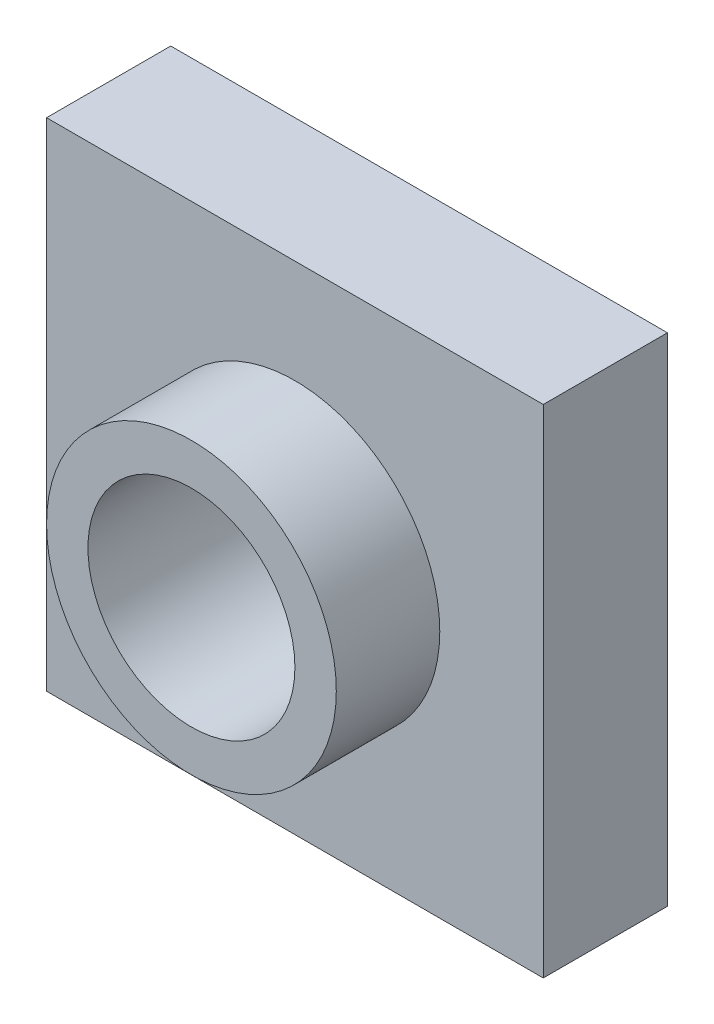
ISO-10303-21;
HEADER;
FILE_DESCRIPTION(('STEP AP214'),'2;1');
FILE_NAME('part.step','',(''),(''),'','','');
FILE_SCHEMA(('AUTOMOTIVE_DESIGN { 1 0 10303 214 1 1 1 1 }'));
ENDSEC;
DATA;
#1=APPLICATION_CONTEXT('core data for automotive mechanical design processes');
#2=APPLICATION_PROTOCOL_DEFINITION('international standard','automotive_design',2000,#1);
#3=PRODUCT_CONTEXT('',#1,'mechanical');
#4=PRODUCT('Part','Part','',(#3));
#5=PRODUCT_RELATED_PRODUCT_CATEGORY('part','',(#4));
#6=PRODUCT_DEFINITION_FORMATION('','',#4);
#7=PRODUCT_DEFINITION_CONTEXT('part definition',#1,'design');
#8=PRODUCT_DEFINITION('design','',#6,#7);
#9=PRODUCT_DEFINITION_SHAPE('','',#8);
#10=(LENGTH_UNIT() NAMED_UNIT(*) SI_UNIT(.MILLI.,.METRE.));
#11=(NAMED_UNIT(*) PLANE_ANGLE_UNIT() SI_UNIT($,.RADIAN.));
#12=(NAMED_UNIT(*) SI_UNIT($,.STERADIAN.) SOLID_ANGLE_UNIT());
#13=UNCERTAINTY_MEASURE_WITH_UNIT(LENGTH_MEASURE(1.E-05),#10,'distance_accuracy_value','');
#14=(GEOMETRIC_REPRESENTATION_CONTEXT(3) GLOBAL_UNCERTAINTY_ASSIGNED_CONTEXT((#13)) GLOBAL_UNIT_ASSIGNED_CONTEXT((#10,
#11,#12)) REPRESENTATION_CONTEXT('',''));
#15=CARTESIAN_POINT('',(0.,0.,0.));
#16=DIRECTION('',(0.,0.,1.));
#17=DIRECTION('',(1.,0.,0.));
#18=AXIS2_PLACEMENT_3D('',#15,#16,#17);
#19=CARTESIAN_POINT('',(0.,120.,30.));
#20=DIRECTION('',(0.,0.,-1.));
#21=DIRECTION('',(-1.,0.,0.));
#22=AXIS2_PLACEMENT_3D('',#19,#20,#21);
#23=PLANE('',#22);
#24=DIRECTION('',(0.,-1.,0.));
#25=VECTOR('',#24,1.);
#26=CARTESIAN_POINT('',(0.,0.,30.));
#27=LINE('',#26,#25);
#28=CARTESIAN_POINT('',(0.,120.,30.));
#29=VERTEX_POINT('',#28);
#30=CARTESIAN_POINT('',(0.,0.,30.));
#31=VERTEX_POINT('',#30);
#32=EDGE_CURVE('E95',#29,#31,#27,.T.);
#33=ORIENTED_EDGE('',*,*,#32,.T.);
#34=DIRECTION('',(1.,0.,0.));
#35=VECTOR('',#34,1.);
#36=CARTESIAN_POINT('',(0.,0.,30.));
#37=LINE('',#36,#35);
#38=CARTESIAN_POINT('',(120.,0.,30.));
#39=VERTEX_POINT('',#38);
#40=EDGE_CURVE('E90',#31,#39,#37,.T.);
#41=ORIENTED_EDGE('',*,*,#40,.T.);
#42=DIRECTION('',(0.,1.,0.));
#43=VECTOR('',#42,1.);
#44=CARTESIAN_POINT('',(120.,0.,30.));
#45=LINE('',#44,#43);
#46=CARTESIAN_POINT('',(120.,120.,30.));
#47=VERTEX_POINT('',#46);
#48=EDGE_CURVE('E93',#39,#47,#45,.T.);
#49=ORIENTED_EDGE('',*,*,#48,.T.);
#50=DIRECTION('',(-1.,0.,0.));
#51=VECTOR('',#50,1.);
#52=CARTESIAN_POINT('',(0.,120.,30.));
#53=LINE('',#52,#51);
#54=EDGE_CURVE('E59',#47,#29,#53,.T.);
#55=ORIENTED_EDGE('',*,*,#54,.T.);
#56=EDGE_LOOP('',(#33,#41,#49,#55));
#57=FACE_BOUND('',#56,.T.);
#58=CARTESIAN_POINT('',(60.,60.,30.));
#59=DIRECTION('',(0.,0.,-1.));
#60=DIRECTION('',(-1.,0.,0.));
#61=AXIS2_PLACEMENT_3D('',#58,#59,#60);
#62=CIRCLE('',#61,35.);
#63=CARTESIAN_POINT('',(25.,60.,30.));
#64=VERTEX_POINT('',#63);
#65=EDGE_CURVE('E11',#64,#64,#62,.F.);
#66=ORIENTED_EDGE('',*,*,#65,.F.);
#67=EDGE_LOOP('',(#66));
#68=FACE_BOUND('',#67,.T.);
#69=ADVANCED_FACE('F42',(#57,#68),#23,.F.);
#70=CARTESIAN_POINT('',(0.,0.,30.));
#71=DIRECTION('',(1.,0.,0.));
#72=DIRECTION('',(0.,0.,-1.));
#73=AXIS2_PLACEMENT_3D('',#70,#71,#72);
#74=PLANE('',#73);
#75=DIRECTION('',(0.,-1.,0.));
#76=VECTOR('',#75,1.);
#77=CARTESIAN_POINT('',(0.,0.,0.));
#78=LINE('',#77,#76);
#79=CARTESIAN_POINT('',(0.,120.,0.));
#80=VERTEX_POINT('',#79);
#81=CARTESIAN_POINT('',(0.,0.,0.));
#82=VERTEX_POINT('',#81);
#83=EDGE_CURVE('E109',#80,#82,#78,.T.);
#84=ORIENTED_EDGE('',*,*,#83,.T.);
#85=DIRECTION('',(0.,0.,-1.));
#86=VECTOR('',#85,1.);
#87=CARTESIAN_POINT('',(0.,0.,30.));
#88=LINE('',#87,#86);
#89=EDGE_CURVE('E51',#31,#82,#88,.T.);
#90=ORIENTED_EDGE('',*,*,#89,.F.);
#91=ORIENTED_EDGE('',*,*,#32,.F.);
#92=DIRECTION('',(0.,0.,-1.));
#93=VECTOR('',#92,1.);
#94=CARTESIAN_POINT('',(0.,120.,30.));
#95=LINE('',#94,#93);
#96=EDGE_CURVE('E105',#29,#80,#95,.T.);
#97=ORIENTED_EDGE('',*,*,#96,.T.);
#98=EDGE_LOOP('',(#84,#90,#91,#97));
#99=FACE_BOUND('',#98,.T.);
#100=ADVANCED_FACE('F44',(#99),#74,.F.);
#101=CARTESIAN_POINT('',(0.,0.,30.));
#102=DIRECTION('',(0.,1.,0.));
#103=DIRECTION('',(0.,0.,1.));
#104=AXIS2_PLACEMENT_3D('',#101,#102,#103);
#105=PLANE('',#104);
#106=DIRECTION('',(1.,0.,0.));
#107=VECTOR('',#106,1.);
#108=CARTESIAN_POINT('',(0.,0.,0.));
#109=LINE('',#108,#107);
#110=CARTESIAN_POINT('',(120.,0.,0.));
#111=VERTEX_POINT('',#110);
#112=EDGE_CURVE('E100',#82,#111,#109,.T.);
#113=ORIENTED_EDGE('',*,*,#112,.T.);
#114=DIRECTION('',(0.,0.,-1.));
#115=VECTOR('',#114,1.);
#116=CARTESIAN_POINT('',(120.,0.,30.));
#117=LINE('',#116,#115);
#118=EDGE_CURVE('E98',#39,#111,#117,.T.);
#119=ORIENTED_EDGE('',*,*,#118,.F.);
#120=ORIENTED_EDGE('',*,*,#40,.F.);
#121=ORIENTED_EDGE('',*,*,#89,.T.);
#122=EDGE_LOOP('',(#113,#119,#120,#121));
#123=FACE_BOUND('',#122,.T.);
#124=ADVANCED_FACE('F99',(#123),#105,.F.);
#125=CARTESIAN_POINT('',(120.,0.,30.));
#126=DIRECTION('',(-1.,0.,0.));
#127=DIRECTION('',(0.,0.,1.));
#128=AXIS2_PLACEMENT_3D('',#125,#126,#127);
#129=PLANE('',#128);
#130=DIRECTION('',(0.,1.,0.));
#131=VECTOR('',#130,1.);
#132=CARTESIAN_POINT('',(120.,0.,0.));
#133=LINE('',#132,#131);
#134=CARTESIAN_POINT('',(120.,120.,0.));
#135=VERTEX_POINT('',#134);
#136=EDGE_CURVE('E76',#111,#135,#133,.T.);
#137=ORIENTED_EDGE('',*,*,#136,.T.);
#138=DIRECTION('',(0.,0.,-1.));
#139=VECTOR('',#138,1.);
#140=CARTESIAN_POINT('',(120.,120.,30.));
#141=LINE('',#140,#139);
#142=EDGE_CURVE('E101',#47,#135,#141,.T.);
#143=ORIENTED_EDGE('',*,*,#142,.F.);
#144=ORIENTED_EDGE('',*,*,#48,.F.);
#145=ORIENTED_EDGE('',*,*,#118,.T.);
#146=EDGE_LOOP('',(#137,#143,#144,#145));
#147=FACE_BOUND('',#146,.T.);
#148=ADVANCED_FACE('F103',(#147),#129,.F.);
#149=CARTESIAN_POINT('',(0.,120.,30.));
#150=DIRECTION('',(0.,-1.,0.));
#151=DIRECTION('',(0.,0.,-1.));
#152=AXIS2_PLACEMENT_3D('',#149,#150,#151);
#153=PLANE('',#152);
#154=DIRECTION('',(-1.,0.,0.));
#155=VECTOR('',#154,1.);
#156=CARTESIAN_POINT('',(0.,120.,0.));
#157=LINE('',#156,#155);
#158=EDGE_CURVE('E82',#135,#80,#157,.T.);
#159=ORIENTED_EDGE('',*,*,#158,.T.);
#160=ORIENTED_EDGE('',*,*,#96,.F.);
#161=ORIENTED_EDGE('',*,*,#54,.F.);
#162=ORIENTED_EDGE('',*,*,#142,.T.);
#163=EDGE_LOOP('',(#159,#160,#161,#162));
#164=FACE_BOUND('',#163,.T.);
#165=ADVANCED_FACE('F123',(#164),#153,.F.);
#166=CARTESIAN_POINT('',(0.,120.,0.));
#167=DIRECTION('',(0.,0.,-1.));
#168=DIRECTION('',(-1.,0.,0.));
#169=AXIS2_PLACEMENT_3D('',#166,#167,#168);
#170=PLANE('',#169);
#171=CARTESIAN_POINT('',(60.,60.,0.));
#172=DIRECTION('',(0.,0.,1.));
#173=DIRECTION('',(1.,0.,0.));
#174=AXIS2_PLACEMENT_3D('',#171,#172,#173);
#175=CIRCLE('',#174,25.);
#176=CARTESIAN_POINT('',(85.,60.,0.));
#177=VERTEX_POINT('',#176);
#178=EDGE_CURVE('E151',#177,#177,#175,.T.);
#179=ORIENTED_EDGE('',*,*,#178,.T.);
#180=EDGE_LOOP('',(#179));
#181=FACE_BOUND('',#180,.T.);
#182=ORIENTED_EDGE('',*,*,#83,.F.);
#183=ORIENTED_EDGE('',*,*,#158,.F.);
#184=ORIENTED_EDGE('',*,*,#136,.F.);
#185=ORIENTED_EDGE('',*,*,#112,.F.);
#186=EDGE_LOOP('',(#182,#183,#184,#185));
#187=FACE_BOUND('',#186,.T.);
#188=ADVANCED_FACE('F120',(#181,#187),#170,.T.);
#189=CARTESIAN_POINT('',(60.,60.,55.));
#190=DIRECTION('',(0.,0.,-1.));
#191=DIRECTION('',(-1.,0.,0.));
#192=AXIS2_PLACEMENT_3D('',#189,#190,#191);
#193=CYLINDRICAL_SURFACE('',#192,35.);
#194=CARTESIAN_POINT('',(60.,60.,55.));
#195=DIRECTION('',(0.,0.,1.));
#196=DIRECTION('',(1.,0.,0.));
#197=AXIS2_PLACEMENT_3D('',#194,#195,#196);
#198=CIRCLE('',#197,35.);
#199=CARTESIAN_POINT('',(95.,60.,55.));
#200=VERTEX_POINT('',#199);
#201=EDGE_CURVE('E112',#200,#200,#198,.T.);
#202=ORIENTED_EDGE('',*,*,#201,.F.);
#203=EDGE_LOOP('',(#202));
#204=FACE_BOUND('',#203,.T.);
#205=ORIENTED_EDGE('',*,*,#65,.T.);
#206=EDGE_LOOP('',(#205));
#207=FACE_BOUND('',#206,.T.);
#208=ADVANCED_FACE('F122',(#204,#207),#193,.T.);
#209=CARTESIAN_POINT('',(60.,60.,55.));
#210=DIRECTION('',(0.,0.,1.));
#211=DIRECTION('',(1.,0.,0.));
#212=AXIS2_PLACEMENT_3D('',#209,#210,#211);
#213=PLANE('',#212);
#214=CARTESIAN_POINT('',(60.,60.,55.));
#215=DIRECTION('',(0.,0.,1.));
#216=DIRECTION('',(1.,0.,0.));
#217=AXIS2_PLACEMENT_3D('',#214,#215,#216);
#218=CIRCLE('',#217,25.);
#219=CARTESIAN_POINT('',(85.,60.,55.));
#220=VERTEX_POINT('',#219);
#221=EDGE_CURVE('E154',#220,#220,#218,.T.);
#222=ORIENTED_EDGE('',*,*,#221,.F.);
#223=EDGE_LOOP('',(#222));
#224=FACE_BOUND('',#223,.T.);
#225=ORIENTED_EDGE('',*,*,#201,.T.);
#226=EDGE_LOOP('',(#225));
#227=FACE_BOUND('',#226,.T.);
#228=ADVANCED_FACE('F130',(#224,#227),#213,.T.);
#229=CARTESIAN_POINT('',(60.,60.,0.));
#230=DIRECTION('',(0.,0.,1.));
#231=DIRECTION('',(1.,0.,0.));
#232=AXIS2_PLACEMENT_3D('',#229,#230,#231);
#233=CYLINDRICAL_SURFACE('',#232,25.);
#234=ORIENTED_EDGE('',*,*,#178,.F.);
#235=EDGE_LOOP('',(#234));
#236=FACE_BOUND('',#235,.T.);
#237=ORIENTED_EDGE('',*,*,#221,.T.);
#238=EDGE_LOOP('',(#237));
#239=FACE_BOUND('',#238,.T.);
#240=ADVANCED_FACE('F143',(#236,#239),#233,.F.);
#241=CLOSED_SHELL('',(#69,#100,#124,#148,#165,#188,#208,#228,#240));
#242=MANIFOLD_SOLID_BREP('B2',#241);
#243=ADVANCED_BREP_SHAPE_REPRESENTATION('',(#18,#242),#14);
#244=SHAPE_DEFINITION_REPRESENTATION(#9,#243);
ENDSEC;
END-ISO-10303-21;
